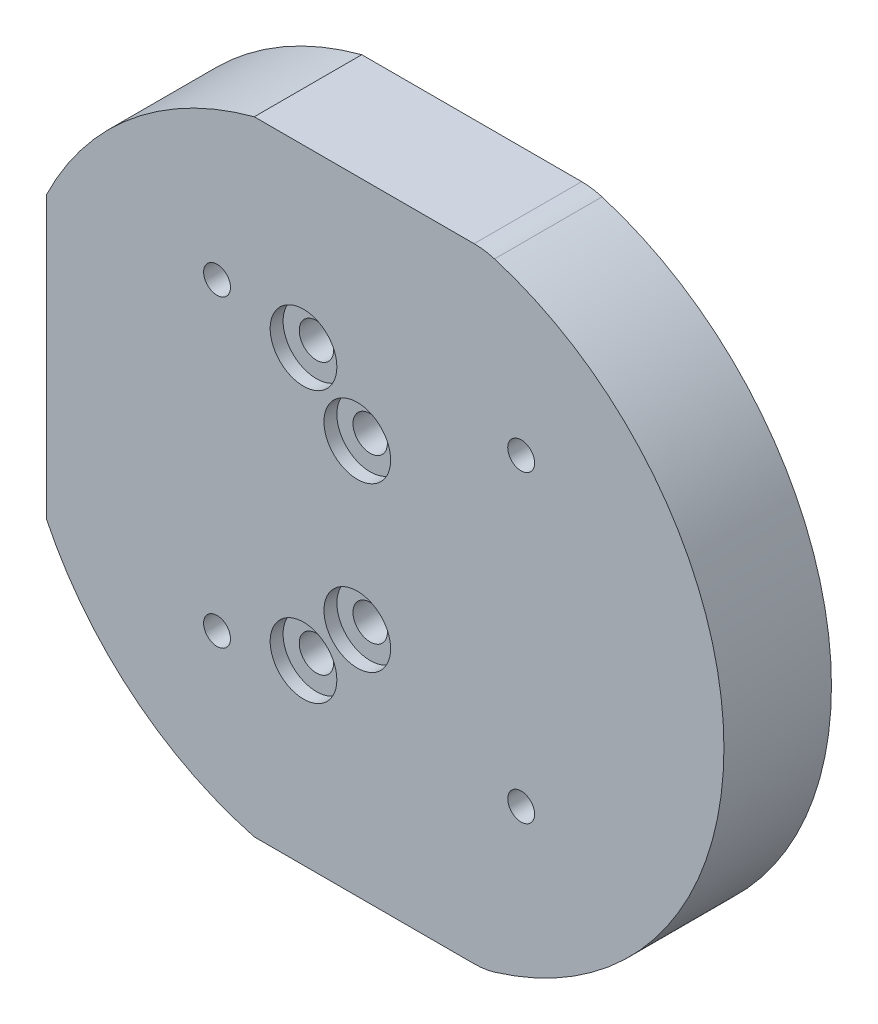
ISO-10303-21;
HEADER;
FILE_DESCRIPTION(('STEP AP214'),'2;1');
FILE_NAME('part.step','',(''),(''),'','','');
FILE_SCHEMA(('AUTOMOTIVE_DESIGN { 1 0 10303 214 1 1 1 1 }'));
ENDSEC;
DATA;
#1=APPLICATION_CONTEXT('core data for automotive mechanical design processes');
#2=APPLICATION_PROTOCOL_DEFINITION('international standard','automotive_design',2000,#1);
#3=PRODUCT_CONTEXT('',#1,'mechanical');
#4=PRODUCT('Part','Part','',(#3));
#5=PRODUCT_RELATED_PRODUCT_CATEGORY('part','',(#4));
#6=PRODUCT_DEFINITION_FORMATION('','',#4);
#7=PRODUCT_DEFINITION_CONTEXT('part definition',#1,'design');
#8=PRODUCT_DEFINITION('design','',#6,#7);
#9=PRODUCT_DEFINITION_SHAPE('','',#8);
#10=(LENGTH_UNIT() NAMED_UNIT(*) SI_UNIT(.MILLI.,.METRE.));
#11=(NAMED_UNIT(*) PLANE_ANGLE_UNIT() SI_UNIT($,.RADIAN.));
#12=(NAMED_UNIT(*) SI_UNIT($,.STERADIAN.) SOLID_ANGLE_UNIT());
#13=UNCERTAINTY_MEASURE_WITH_UNIT(LENGTH_MEASURE(1.E-05),#10,'distance_accuracy_value','');
#14=(GEOMETRIC_REPRESENTATION_CONTEXT(3) GLOBAL_UNCERTAINTY_ASSIGNED_CONTEXT((#13)) GLOBAL_UNIT_ASSIGNED_CONTEXT((#10,
#11,#12)) REPRESENTATION_CONTEXT('',''));
#15=CARTESIAN_POINT('',(0.,0.,0.));
#16=DIRECTION('',(0.,0.,1.));
#17=DIRECTION('',(1.,0.,0.));
#18=AXIS2_PLACEMENT_3D('',#15,#16,#17);
#19=CARTESIAN_POINT('',(-4.1,-21.3115488460901,8.8));
#20=DIRECTION('',(0.,0.,1.));
#21=DIRECTION('',(1.,0.,0.));
#22=AXIS2_PLACEMENT_3D('',#19,#20,#21);
#23=CYLINDRICAL_SURFACE('',#22,3.1);
#24=CARTESIAN_POINT('',(-4.1,-21.3115488460901,8.8));
#25=DIRECTION('',(0.,0.,1.));
#26=DIRECTION('',(1.,0.,0.));
#27=AXIS2_PLACEMENT_3D('',#24,#25,#26);
#28=CIRCLE('',#27,3.1);
#29=CARTESIAN_POINT('',(-1.,-21.3115488460901,8.8));
#30=VERTEX_POINT('',#29);
#31=EDGE_CURVE('E10',#30,#30,#28,.T.);
#32=ORIENTED_EDGE('',*,*,#31,.F.);
#33=EDGE_LOOP('',(#32));
#34=FACE_BOUND('',#33,.T.);
#35=CARTESIAN_POINT('',(-4.1,-21.3115488460901,10.));
#36=DIRECTION('',(0.,0.,1.));
#37=DIRECTION('',(1.,0.,0.));
#38=AXIS2_PLACEMENT_3D('',#35,#36,#37);
#39=CIRCLE('',#38,3.1);
#40=CARTESIAN_POINT('',(-1.,-21.3115488460901,10.));
#41=VERTEX_POINT('',#40);
#42=EDGE_CURVE('E243',#41,#41,#39,.T.);
#43=ORIENTED_EDGE('',*,*,#42,.T.);
#44=EDGE_LOOP('',(#43));
#45=FACE_BOUND('',#44,.T.);
#46=ADVANCED_FACE('F16',(#34,#45),#23,.F.);
#47=CARTESIAN_POINT('',(-4.1,-21.3115488460901,8.8));
#48=DIRECTION('',(0.,0.,1.));
#49=DIRECTION('',(1.,0.,0.));
#50=AXIS2_PLACEMENT_3D('',#47,#48,#49);
#51=PLANE('',#50);
#52=CARTESIAN_POINT('',(-4.1,-21.3115488460901,8.8));
#53=DIRECTION('',(0.,0.,-1.));
#54=DIRECTION('',(1.,0.,0.));
#55=AXIS2_PLACEMENT_3D('',#52,#53,#54);
#56=CIRCLE('',#55,1.6);
#57=CARTESIAN_POINT('',(-2.5,-21.3115488460901,8.8));
#58=VERTEX_POINT('',#57);
#59=EDGE_CURVE('E794',#58,#58,#56,.T.);
#60=ORIENTED_EDGE('',*,*,#59,.T.);
#61=EDGE_LOOP('',(#60));
#62=FACE_BOUND('',#61,.T.);
#63=ORIENTED_EDGE('',*,*,#31,.T.);
#64=EDGE_LOOP('',(#63));
#65=FACE_BOUND('',#64,.T.);
#66=ADVANCED_FACE('F480',(#62,#65),#51,.T.);
#67=CARTESIAN_POINT('',(-9.1,-16.3115488460901,8.8));
#68=DIRECTION('',(0.,0.,1.));
#69=DIRECTION('',(1.,0.,0.));
#70=AXIS2_PLACEMENT_3D('',#67,#68,#69);
#71=CYLINDRICAL_SURFACE('',#70,3.1);
#72=CARTESIAN_POINT('',(-9.1,-16.3115488460901,8.8));
#73=DIRECTION('',(0.,0.,1.));
#74=DIRECTION('',(1.,0.,0.));
#75=AXIS2_PLACEMENT_3D('',#72,#73,#74);
#76=CIRCLE('',#75,3.1);
#77=CARTESIAN_POINT('',(-6.,-16.3115488460901,8.8));
#78=VERTEX_POINT('',#77);
#79=EDGE_CURVE('E30',#78,#78,#76,.T.);
#80=ORIENTED_EDGE('',*,*,#79,.F.);
#81=EDGE_LOOP('',(#80));
#82=FACE_BOUND('',#81,.T.);
#83=CARTESIAN_POINT('',(-9.1,-16.3115488460901,10.));
#84=DIRECTION('',(0.,0.,1.));
#85=DIRECTION('',(1.,0.,0.));
#86=AXIS2_PLACEMENT_3D('',#83,#84,#85);
#87=CIRCLE('',#86,3.1);
#88=CARTESIAN_POINT('',(-6.,-16.3115488460901,10.));
#89=VERTEX_POINT('',#88);
#90=EDGE_CURVE('E199',#89,#89,#87,.T.);
#91=ORIENTED_EDGE('',*,*,#90,.T.);
#92=EDGE_LOOP('',(#91));
#93=FACE_BOUND('',#92,.T.);
#94=ADVANCED_FACE('F477',(#82,#93),#71,.F.);
#95=CARTESIAN_POINT('',(-9.1,-16.3115488460901,8.8));
#96=DIRECTION('',(0.,0.,1.));
#97=DIRECTION('',(1.,0.,0.));
#98=AXIS2_PLACEMENT_3D('',#95,#96,#97);
#99=PLANE('',#98);
#100=CARTESIAN_POINT('',(-9.1,-16.3115488460901,8.8));
#101=DIRECTION('',(0.,0.,-1.));
#102=DIRECTION('',(1.,0.,0.));
#103=AXIS2_PLACEMENT_3D('',#100,#101,#102);
#104=CIRCLE('',#103,1.6);
#105=CARTESIAN_POINT('',(-7.5,-16.3115488460901,8.8));
#106=VERTEX_POINT('',#105);
#107=EDGE_CURVE('E774',#106,#106,#104,.T.);
#108=ORIENTED_EDGE('',*,*,#107,.T.);
#109=EDGE_LOOP('',(#108));
#110=FACE_BOUND('',#109,.T.);
#111=ORIENTED_EDGE('',*,*,#79,.T.);
#112=EDGE_LOOP('',(#111));
#113=FACE_BOUND('',#112,.T.);
#114=ADVANCED_FACE('F479',(#110,#113),#99,.T.);
#115=CARTESIAN_POINT('',(-4.1,-36.5115488460901,8.8));
#116=DIRECTION('',(0.,0.,1.));
#117=DIRECTION('',(1.,0.,0.));
#118=AXIS2_PLACEMENT_3D('',#115,#116,#117);
#119=CYLINDRICAL_SURFACE('',#118,3.1);
#120=CARTESIAN_POINT('',(-4.1,-36.5115488460901,8.8));
#121=DIRECTION('',(0.,0.,1.));
#122=DIRECTION('',(1.,0.,0.));
#123=AXIS2_PLACEMENT_3D('',#120,#121,#122);
#124=CIRCLE('',#123,3.1);
#125=CARTESIAN_POINT('',(-1.,-36.5115488460901,8.8));
#126=VERTEX_POINT('',#125);
#127=EDGE_CURVE('E225',#126,#126,#124,.T.);
#128=ORIENTED_EDGE('',*,*,#127,.F.);
#129=EDGE_LOOP('',(#128));
#130=FACE_BOUND('',#129,.T.);
#131=CARTESIAN_POINT('',(-4.1,-36.5115488460901,10.));
#132=DIRECTION('',(0.,0.,1.));
#133=DIRECTION('',(1.,0.,0.));
#134=AXIS2_PLACEMENT_3D('',#131,#132,#133);
#135=CIRCLE('',#134,3.1);
#136=CARTESIAN_POINT('',(-1.,-36.5115488460901,10.));
#137=VERTEX_POINT('',#136);
#138=EDGE_CURVE('E229',#137,#137,#135,.T.);
#139=ORIENTED_EDGE('',*,*,#138,.T.);
#140=EDGE_LOOP('',(#139));
#141=FACE_BOUND('',#140,.T.);
#142=ADVANCED_FACE('F488',(#130,#141),#119,.F.);
#143=CARTESIAN_POINT('',(-4.1,-36.5115488460901,8.8));
#144=DIRECTION('',(0.,0.,1.));
#145=DIRECTION('',(1.,0.,0.));
#146=AXIS2_PLACEMENT_3D('',#143,#144,#145);
#147=PLANE('',#146);
#148=CARTESIAN_POINT('',(-4.1,-36.5115488460901,8.8));
#149=DIRECTION('',(0.,0.,-1.));
#150=DIRECTION('',(1.,0.,0.));
#151=AXIS2_PLACEMENT_3D('',#148,#149,#150);
#152=CIRCLE('',#151,1.6);
#153=CARTESIAN_POINT('',(-2.5,-36.5115488460901,8.8));
#154=VERTEX_POINT('',#153);
#155=EDGE_CURVE('E427',#154,#154,#152,.T.);
#156=ORIENTED_EDGE('',*,*,#155,.T.);
#157=EDGE_LOOP('',(#156));
#158=FACE_BOUND('',#157,.T.);
#159=ORIENTED_EDGE('',*,*,#127,.T.);
#160=EDGE_LOOP('',(#159));
#161=FACE_BOUND('',#160,.T.);
#162=ADVANCED_FACE('F896',(#158,#161),#147,.T.);
#163=CARTESIAN_POINT('',(-9.1,-41.5115488460901,8.8));
#164=DIRECTION('',(0.,0.,1.));
#165=DIRECTION('',(1.,0.,0.));
#166=AXIS2_PLACEMENT_3D('',#163,#164,#165);
#167=CYLINDRICAL_SURFACE('',#166,3.1);
#168=CARTESIAN_POINT('',(-9.1,-41.5115488460901,8.8));
#169=DIRECTION('',(0.,0.,1.));
#170=DIRECTION('',(1.,0.,0.));
#171=AXIS2_PLACEMENT_3D('',#168,#169,#170);
#172=CIRCLE('',#171,3.1);
#173=CARTESIAN_POINT('',(-6.,-41.5115488460901,8.8));
#174=VERTEX_POINT('',#173);
#175=EDGE_CURVE('E306',#174,#174,#172,.T.);
#176=ORIENTED_EDGE('',*,*,#175,.F.);
#177=EDGE_LOOP('',(#176));
#178=FACE_BOUND('',#177,.T.);
#179=CARTESIAN_POINT('',(-9.1,-41.5115488460901,10.));
#180=DIRECTION('',(0.,0.,1.));
#181=DIRECTION('',(1.,0.,0.));
#182=AXIS2_PLACEMENT_3D('',#179,#180,#181);
#183=CIRCLE('',#182,3.1);
#184=CARTESIAN_POINT('',(-6.,-41.5115488460901,10.));
#185=VERTEX_POINT('',#184);
#186=EDGE_CURVE('E239',#185,#185,#183,.T.);
#187=ORIENTED_EDGE('',*,*,#186,.T.);
#188=EDGE_LOOP('',(#187));
#189=FACE_BOUND('',#188,.T.);
#190=ADVANCED_FACE('F905',(#178,#189),#167,.F.);
#191=CARTESIAN_POINT('',(-9.1,-41.5115488460901,8.8));
#192=DIRECTION('',(0.,0.,1.));
#193=DIRECTION('',(1.,0.,0.));
#194=AXIS2_PLACEMENT_3D('',#191,#192,#193);
#195=PLANE('',#194);
#196=CARTESIAN_POINT('',(-9.1,-41.5115488460901,8.8));
#197=DIRECTION('',(0.,0.,-1.));
#198=DIRECTION('',(1.,0.,0.));
#199=AXIS2_PLACEMENT_3D('',#196,#197,#198);
#200=CIRCLE('',#199,1.6);
#201=CARTESIAN_POINT('',(-7.5,-41.5115488460901,8.8));
#202=VERTEX_POINT('',#201);
#203=EDGE_CURVE('E436',#202,#202,#200,.T.);
#204=ORIENTED_EDGE('',*,*,#203,.T.);
#205=EDGE_LOOP('',(#204));
#206=FACE_BOUND('',#205,.T.);
#207=ORIENTED_EDGE('',*,*,#175,.T.);
#208=EDGE_LOOP('',(#207));
#209=FACE_BOUND('',#208,.T.);
#210=ADVANCED_FACE('F914',(#206,#209),#195,.T.);
#211=CARTESIAN_POINT('',(4.1,-12.5615488460901,6.63553390593274));
#212=DIRECTION('',(0.,0.,-1.));
#213=DIRECTION('',(-1.,0.,0.));
#214=AXIS2_PLACEMENT_3D('',#211,#212,#213);
#215=CYLINDRICAL_SURFACE('',#214,1.25);
#216=CARTESIAN_POINT('',(4.1,-12.5615488460901,3.1));
#217=DIRECTION('',(0.,0.,-1.));
#218=DIRECTION('',(1.,0.,0.));
#219=AXIS2_PLACEMENT_3D('',#216,#217,#218);
#220=CIRCLE('',#219,1.25);
#221=CARTESIAN_POINT('',(4.1,-11.3115488460901,3.1));
#222=VERTEX_POINT('',#221);
#223=CARTESIAN_POINT('',(4.1,-13.8115488460901,3.1));
#224=VERTEX_POINT('',#223);
#225=EDGE_CURVE('E289',#222,#224,#220,.T.);
#226=ORIENTED_EDGE('',*,*,#225,.F.);
#227=DIRECTION('',(0.,0.,-1.));
#228=VECTOR('',#227,1.);
#229=CARTESIAN_POINT('',(4.1,-11.3115488460901,45.826758636053));
#230=LINE('',#229,#228);
#231=CARTESIAN_POINT('',(4.1,-11.3115488460901,0.));
#232=VERTEX_POINT('',#231);
#233=EDGE_CURVE('E293',#222,#232,#230,.T.);
#234=ORIENTED_EDGE('',*,*,#233,.T.);
#235=CARTESIAN_POINT('',(4.1,-12.5615488460901,0.));
#236=DIRECTION('',(0.,0.,-1.));
#237=DIRECTION('',(-1.,0.,0.));
#238=AXIS2_PLACEMENT_3D('',#235,#236,#237);
#239=CIRCLE('',#238,1.25);
#240=CARTESIAN_POINT('',(4.1,-13.8115488460901,0.));
#241=VERTEX_POINT('',#240);
#242=EDGE_CURVE('E219',#232,#241,#239,.T.);
#243=ORIENTED_EDGE('',*,*,#242,.T.);
#244=DIRECTION('',(0.,0.,-1.));
#245=VECTOR('',#244,1.);
#246=CARTESIAN_POINT('',(4.1,-13.8115488460901,6.63553390593274));
#247=LINE('',#246,#245);
#248=EDGE_CURVE('E359',#224,#241,#247,.T.);
#249=ORIENTED_EDGE('',*,*,#248,.F.);
#250=EDGE_LOOP('',(#226,#234,#243,#249));
#251=FACE_BOUND('',#250,.T.);
#252=ADVANCED_FACE('F529',(#251),#215,.F.);
#253=CARTESIAN_POINT('',(4.1,-45.2615488460901,6.63553390593274));
#254=DIRECTION('',(0.,0.,-1.));
#255=DIRECTION('',(-1.,0.,0.));
#256=AXIS2_PLACEMENT_3D('',#253,#254,#255);
#257=CYLINDRICAL_SURFACE('',#256,1.25);
#258=CARTESIAN_POINT('',(4.1,-45.2615488460901,0.));
#259=DIRECTION('',(0.,0.,-1.));
#260=DIRECTION('',(-1.,0.,0.));
#261=AXIS2_PLACEMENT_3D('',#258,#259,#260);
#262=CIRCLE('',#261,1.25);
#263=CARTESIAN_POINT('',(4.1,-44.0115488460901,0.));
#264=VERTEX_POINT('',#263);
#265=CARTESIAN_POINT('',(4.1,-46.5115488460901,0.));
#266=VERTEX_POINT('',#265);
#267=EDGE_CURVE('E352',#264,#266,#262,.T.);
#268=ORIENTED_EDGE('',*,*,#267,.T.);
#269=DIRECTION('',(0.,0.,-1.));
#270=VECTOR('',#269,1.);
#271=CARTESIAN_POINT('',(4.1,-46.5115488460901,45.826758636053));
#272=LINE('',#271,#270);
#273=CARTESIAN_POINT('',(4.1,-46.5115488460901,3.1));
#274=VERTEX_POINT('',#273);
#275=EDGE_CURVE('E279',#274,#266,#272,.T.);
#276=ORIENTED_EDGE('',*,*,#275,.F.);
#277=CARTESIAN_POINT('',(4.1,-45.2615488460901,3.1));
#278=DIRECTION('',(0.,0.,-1.));
#279=DIRECTION('',(1.,0.,0.));
#280=AXIS2_PLACEMENT_3D('',#277,#278,#279);
#281=CIRCLE('',#280,1.25);
#282=CARTESIAN_POINT('',(4.1,-44.0115488460901,3.1));
#283=VERTEX_POINT('',#282);
#284=EDGE_CURVE('E44',#283,#274,#281,.T.);
#285=ORIENTED_EDGE('',*,*,#284,.F.);
#286=DIRECTION('',(0.,0.,1.));
#287=VECTOR('',#286,1.);
#288=CARTESIAN_POINT('',(4.1,-44.0115488460901,6.63553390593274));
#289=LINE('',#288,#287);
#290=EDGE_CURVE('E297',#264,#283,#289,.T.);
#291=ORIENTED_EDGE('',*,*,#290,.F.);
#292=EDGE_LOOP('',(#268,#276,#285,#291));
#293=FACE_BOUND('',#292,.T.);
#294=ADVANCED_FACE('F524',(#293),#257,.F.);
#295=CARTESIAN_POINT('',(0.,0.,3.1));
#296=DIRECTION('',(0.,0.,1.));
#297=DIRECTION('',(1.,0.,0.));
#298=AXIS2_PLACEMENT_3D('',#295,#296,#297);
#299=PLANE('',#298);
#300=CARTESIAN_POINT('',(-9.1,-41.5115488460901,3.1));
#301=DIRECTION('',(0.,0.,1.));
#302=DIRECTION('',(1.,0.,0.));
#303=AXIS2_PLACEMENT_3D('',#300,#301,#302);
#304=CIRCLE('',#303,1.6);
#305=CARTESIAN_POINT('',(-7.5,-41.5115488460901,3.1));
#306=VERTEX_POINT('',#305);
#307=EDGE_CURVE('E423',#306,#306,#304,.T.);
#308=ORIENTED_EDGE('',*,*,#307,.T.);
#309=EDGE_LOOP('',(#308));
#310=FACE_BOUND('',#309,.T.);
#311=CARTESIAN_POINT('',(-4.1,-21.3115488460901,3.1));
#312=DIRECTION('',(0.,0.,1.));
#313=DIRECTION('',(1.,0.,0.));
#314=AXIS2_PLACEMENT_3D('',#311,#312,#313);
#315=CIRCLE('',#314,1.6);
#316=CARTESIAN_POINT('',(-2.5,-21.3115488460901,3.1));
#317=VERTEX_POINT('',#316);
#318=EDGE_CURVE('E536',#317,#317,#315,.T.);
#319=ORIENTED_EDGE('',*,*,#318,.T.);
#320=EDGE_LOOP('',(#319));
#321=FACE_BOUND('',#320,.T.);
#322=CARTESIAN_POINT('',(-4.1,-36.5115488460901,3.1));
#323=DIRECTION('',(0.,0.,1.));
#324=DIRECTION('',(1.,0.,0.));
#325=AXIS2_PLACEMENT_3D('',#322,#323,#324);
#326=CIRCLE('',#325,1.6);
#327=CARTESIAN_POINT('',(-2.5,-36.5115488460901,3.1));
#328=VERTEX_POINT('',#327);
#329=EDGE_CURVE('E431',#328,#328,#326,.T.);
#330=ORIENTED_EDGE('',*,*,#329,.T.);
#331=EDGE_LOOP('',(#330));
#332=FACE_BOUND('',#331,.T.);
#333=CARTESIAN_POINT('',(-9.1,-16.3115488460901,3.1));
#334=DIRECTION('',(0.,0.,1.));
#335=DIRECTION('',(1.,0.,0.));
#336=AXIS2_PLACEMENT_3D('',#333,#334,#335);
#337=CIRCLE('',#336,1.6);
#338=CARTESIAN_POINT('',(-7.5,-16.3115488460901,3.1));
#339=VERTEX_POINT('',#338);
#340=EDGE_CURVE('E432',#339,#339,#337,.T.);
#341=ORIENTED_EDGE('',*,*,#340,.T.);
#342=EDGE_LOOP('',(#341));
#343=FACE_BOUND('',#342,.T.);
#344=DIRECTION('',(1.,0.,0.));
#345=VECTOR('',#344,1.);
#346=CARTESIAN_POINT('',(4.1,-11.3115488460901,3.1));
#347=LINE('',#346,#345);
#348=CARTESIAN_POINT('',(-9.1,-11.3115488460901,3.1));
#349=VERTEX_POINT('',#348);
#350=EDGE_CURVE('E296',#349,#222,#347,.T.);
#351=ORIENTED_EDGE('',*,*,#350,.T.);
#352=ORIENTED_EDGE('',*,*,#225,.T.);
#353=DIRECTION('',(0.,-1.,0.));
#354=VECTOR('',#353,1.);
#355=CARTESIAN_POINT('',(4.1,-46.5115488460901,3.1));
#356=LINE('',#355,#354);
#357=EDGE_CURVE('E356',#224,#283,#356,.T.);
#358=ORIENTED_EDGE('',*,*,#357,.T.);
#359=ORIENTED_EDGE('',*,*,#284,.T.);
#360=DIRECTION('',(-1.,0.,0.));
#361=VECTOR('',#360,1.);
#362=CARTESIAN_POINT('',(4.1,-46.5115488460901,3.1));
#363=LINE('',#362,#361);
#364=CARTESIAN_POINT('',(-9.1,-46.5115488460901,3.1));
#365=VERTEX_POINT('',#364);
#366=EDGE_CURVE('E52',#274,#365,#363,.T.);
#367=ORIENTED_EDGE('',*,*,#366,.T.);
#368=CARTESIAN_POINT('',(-9.1,-41.5115488460901,3.1));
#369=DIRECTION('',(0.,0.,-1.));
#370=DIRECTION('',(1.,0.,0.));
#371=AXIS2_PLACEMENT_3D('',#368,#369,#370);
#372=CIRCLE('',#371,5.);
#373=CARTESIAN_POINT('',(-14.1,-41.5115488460901,3.1));
#374=VERTEX_POINT('',#373);
#375=EDGE_CURVE('E373',#365,#374,#372,.T.);
#376=ORIENTED_EDGE('',*,*,#375,.T.);
#377=DIRECTION('',(0.,1.,0.));
#378=VECTOR('',#377,1.);
#379=CARTESIAN_POINT('',(-14.1,-41.5115488460901,3.1));
#380=LINE('',#379,#378);
#381=CARTESIAN_POINT('',(-14.1,-16.3115488460901,3.1));
#382=VERTEX_POINT('',#381);
#383=EDGE_CURVE('E346',#374,#382,#380,.T.);
#384=ORIENTED_EDGE('',*,*,#383,.T.);
#385=CARTESIAN_POINT('',(-9.1,-16.3115488460901,3.1));
#386=DIRECTION('',(0.,0.,-1.));
#387=DIRECTION('',(1.,0.,0.));
#388=AXIS2_PLACEMENT_3D('',#385,#386,#387);
#389=CIRCLE('',#388,5.);
#390=EDGE_CURVE('E347',#382,#349,#389,.T.);
#391=ORIENTED_EDGE('',*,*,#390,.T.);
#392=EDGE_LOOP('',(#351,#352,#358,#359,#367,#376,#384,#391));
#393=FACE_BOUND('',#392,.T.);
#394=ADVANCED_FACE('F521',(#310,#321,#332,#343,#393),#299,.F.);
#395=CARTESIAN_POINT('',(4.1,-46.5115488460901,45.826758636053));
#396=DIRECTION('',(0.,-1.,0.));
#397=DIRECTION('',(0.,0.,-1.));
#398=AXIS2_PLACEMENT_3D('',#395,#396,#397);
#399=PLANE('',#398);
#400=DIRECTION('',(0.,0.,-1.));
#401=VECTOR('',#400,1.);
#402=CARTESIAN_POINT('',(-9.1,-46.5115488460901,45.826758636053));
#403=LINE('',#402,#401);
#404=CARTESIAN_POINT('',(-9.1,-46.5115488460901,0.));
#405=VERTEX_POINT('',#404);
#406=EDGE_CURVE('E215',#365,#405,#403,.T.);
#407=ORIENTED_EDGE('',*,*,#406,.F.);
#408=ORIENTED_EDGE('',*,*,#366,.F.);
#409=ORIENTED_EDGE('',*,*,#275,.T.);
#410=DIRECTION('',(1.,0.,0.));
#411=VECTOR('',#410,1.);
#412=CARTESIAN_POINT('',(0.,-46.5115488460901,0.));
#413=LINE('',#412,#411);
#414=EDGE_CURVE('E350',#405,#266,#413,.T.);
#415=ORIENTED_EDGE('',*,*,#414,.F.);
#416=EDGE_LOOP('',(#407,#408,#409,#415));
#417=FACE_BOUND('',#416,.T.);
#418=ADVANCED_FACE('F518',(#417),#399,.F.);
#419=CARTESIAN_POINT('',(-9.1,-41.5115488460901,45.826758636053));
#420=DIRECTION('',(0.,0.,-1.));
#421=DIRECTION('',(-1.,0.,0.));
#422=AXIS2_PLACEMENT_3D('',#419,#420,#421);
#423=CYLINDRICAL_SURFACE('',#422,5.);
#424=DIRECTION('',(0.,0.,-1.));
#425=VECTOR('',#424,1.);
#426=CARTESIAN_POINT('',(-14.1,-41.5115488460901,45.826758636053));
#427=LINE('',#426,#425);
#428=CARTESIAN_POINT('',(-14.1,-41.5115488460901,0.));
#429=VERTEX_POINT('',#428);
#430=EDGE_CURVE('E376',#374,#429,#427,.T.);
#431=ORIENTED_EDGE('',*,*,#430,.F.);
#432=ORIENTED_EDGE('',*,*,#375,.F.);
#433=ORIENTED_EDGE('',*,*,#406,.T.);
#434=CARTESIAN_POINT('',(-9.1,-41.5115488460901,0.));
#435=DIRECTION('',(0.,0.,1.));
#436=DIRECTION('',(1.,0.,0.));
#437=AXIS2_PLACEMENT_3D('',#434,#435,#436);
#438=CIRCLE('',#437,5.);
#439=EDGE_CURVE('E342',#429,#405,#438,.T.);
#440=ORIENTED_EDGE('',*,*,#439,.F.);
#441=EDGE_LOOP('',(#431,#432,#433,#440));
#442=FACE_BOUND('',#441,.T.);
#443=ADVANCED_FACE('F514',(#442),#423,.F.);
#444=CARTESIAN_POINT('',(-14.1,-41.5115488460901,45.826758636053));
#445=DIRECTION('',(-1.,0.,0.));
#446=DIRECTION('',(0.,0.,1.));
#447=AXIS2_PLACEMENT_3D('',#444,#445,#446);
#448=PLANE('',#447);
#449=DIRECTION('',(0.,0.,-1.));
#450=VECTOR('',#449,1.);
#451=CARTESIAN_POINT('',(-14.1,-16.3115488460901,45.826758636053));
#452=LINE('',#451,#450);
#453=CARTESIAN_POINT('',(-14.1,-16.3115488460901,0.));
#454=VERTEX_POINT('',#453);
#455=EDGE_CURVE('E343',#382,#454,#452,.T.);
#456=ORIENTED_EDGE('',*,*,#455,.F.);
#457=ORIENTED_EDGE('',*,*,#383,.F.);
#458=ORIENTED_EDGE('',*,*,#430,.T.);
#459=DIRECTION('',(0.,-1.,0.));
#460=VECTOR('',#459,1.);
#461=CARTESIAN_POINT('',(-14.1,0.,0.));
#462=LINE('',#461,#460);
#463=EDGE_CURVE('E338',#454,#429,#462,.T.);
#464=ORIENTED_EDGE('',*,*,#463,.F.);
#465=EDGE_LOOP('',(#456,#457,#458,#464));
#466=FACE_BOUND('',#465,.T.);
#467=ADVANCED_FACE('F510',(#466),#448,.F.);
#468=CARTESIAN_POINT('',(-9.1,-16.3115488460901,45.826758636053));
#469=DIRECTION('',(0.,0.,-1.));
#470=DIRECTION('',(-1.,0.,0.));
#471=AXIS2_PLACEMENT_3D('',#468,#469,#470);
#472=CYLINDRICAL_SURFACE('',#471,5.);
#473=DIRECTION('',(0.,0.,-1.));
#474=VECTOR('',#473,1.);
#475=CARTESIAN_POINT('',(-9.1,-11.3115488460901,45.826758636053));
#476=LINE('',#475,#474);
#477=CARTESIAN_POINT('',(-9.1,-11.3115488460901,0.));
#478=VERTEX_POINT('',#477);
#479=EDGE_CURVE('E368',#349,#478,#476,.T.);
#480=ORIENTED_EDGE('',*,*,#479,.F.);
#481=ORIENTED_EDGE('',*,*,#390,.F.);
#482=ORIENTED_EDGE('',*,*,#455,.T.);
#483=CARTESIAN_POINT('',(-9.1,-16.3115488460901,0.));
#484=DIRECTION('',(0.,0.,1.));
#485=DIRECTION('',(1.,0.,0.));
#486=AXIS2_PLACEMENT_3D('',#483,#484,#485);
#487=CIRCLE('',#486,5.);
#488=EDGE_CURVE('E334',#478,#454,#487,.T.);
#489=ORIENTED_EDGE('',*,*,#488,.F.);
#490=EDGE_LOOP('',(#480,#481,#482,#489));
#491=FACE_BOUND('',#490,.T.);
#492=ADVANCED_FACE('F507',(#491),#472,.F.);
#493=CARTESIAN_POINT('',(4.1,-11.3115488460901,45.826758636053));
#494=DIRECTION('',(0.,1.,0.));
#495=DIRECTION('',(1.,0.,0.));
#496=AXIS2_PLACEMENT_3D('',#493,#494,#495);
#497=PLANE('',#496);
#498=ORIENTED_EDGE('',*,*,#233,.F.);
#499=ORIENTED_EDGE('',*,*,#350,.F.);
#500=ORIENTED_EDGE('',*,*,#479,.T.);
#501=DIRECTION('',(-1.,0.,0.));
#502=VECTOR('',#501,1.);
#503=CARTESIAN_POINT('',(0.,-11.3115488460901,0.));
#504=LINE('',#503,#502);
#505=EDGE_CURVE('E330',#232,#478,#504,.T.);
#506=ORIENTED_EDGE('',*,*,#505,.F.);
#507=EDGE_LOOP('',(#498,#499,#500,#506));
#508=FACE_BOUND('',#507,.T.);
#509=ADVANCED_FACE('F505',(#508),#497,.F.);
#510=CARTESIAN_POINT('',(4.1,-46.5115488460901,45.826758636053));
#511=DIRECTION('',(1.,0.,0.));
#512=DIRECTION('',(0.,1.,0.));
#513=AXIS2_PLACEMENT_3D('',#510,#511,#512);
#514=PLANE('',#513);
#515=ORIENTED_EDGE('',*,*,#357,.F.);
#516=ORIENTED_EDGE('',*,*,#248,.T.);
#517=DIRECTION('',(0.,1.,0.));
#518=VECTOR('',#517,1.);
#519=CARTESIAN_POINT('',(4.1,0.,0.));
#520=LINE('',#519,#518);
#521=EDGE_CURVE('E216',#264,#241,#520,.T.);
#522=ORIENTED_EDGE('',*,*,#521,.F.);
#523=ORIENTED_EDGE('',*,*,#290,.T.);
#524=EDGE_LOOP('',(#515,#516,#522,#523));
#525=FACE_BOUND('',#524,.T.);
#526=ADVANCED_FACE('F554',(#525),#514,.F.);
#527=CARTESIAN_POINT('',(0.,0.,0.));
#528=DIRECTION('',(0.,0.,1.));
#529=DIRECTION('',(1.,0.,0.));
#530=AXIS2_PLACEMENT_3D('',#527,#528,#529);
#531=PLANE('',#530);
#532=CARTESIAN_POINT('',(-17.1421356237307,-43.1421356237324,0.));
#533=DIRECTION('',(0.,0.,1.));
#534=DIRECTION('',(1.,0.,0.));
#535=AXIS2_PLACEMENT_3D('',#532,#533,#534);
#536=CIRCLE('',#535,1.25);
#537=CARTESIAN_POINT('',(-15.8921356237307,-43.1421356237324,0.));
#538=VERTEX_POINT('',#537);
#539=EDGE_CURVE('E257',#538,#538,#536,.T.);
#540=ORIENTED_EDGE('',*,*,#539,.T.);
#541=EDGE_LOOP('',(#540));
#542=FACE_BOUND('',#541,.T.);
#543=CARTESIAN_POINT('',(-17.1421356237305,-14.8578643762705,0.));
#544=DIRECTION('',(0.,0.,1.));
#545=DIRECTION('',(1.,0.,0.));
#546=AXIS2_PLACEMENT_3D('',#543,#544,#545);
#547=CIRCLE('',#546,1.25);
#548=CARTESIAN_POINT('',(-15.8921356237305,-14.8578643762705,0.));
#549=VERTEX_POINT('',#548);
#550=EDGE_CURVE('E261',#549,#549,#547,.T.);
#551=ORIENTED_EDGE('',*,*,#550,.T.);
#552=EDGE_LOOP('',(#551));
#553=FACE_BOUND('',#552,.T.);
#554=CARTESIAN_POINT('',(11.1421356237315,-14.8578643762708,0.));
#555=DIRECTION('',(0.,0.,1.));
#556=DIRECTION('',(1.,0.,0.));
#557=AXIS2_PLACEMENT_3D('',#554,#555,#556);
#558=CIRCLE('',#557,1.25);
#559=CARTESIAN_POINT('',(12.3921356237315,-14.8578643762708,0.));
#560=VERTEX_POINT('',#559);
#561=EDGE_CURVE('E262',#560,#560,#558,.T.);
#562=ORIENTED_EDGE('',*,*,#561,.T.);
#563=EDGE_LOOP('',(#562));
#564=FACE_BOUND('',#563,.T.);
#565=CARTESIAN_POINT('',(11.1421356237311,-43.1421356237327,0.));
#566=DIRECTION('',(0.,0.,1.));
#567=DIRECTION('',(1.,0.,0.));
#568=AXIS2_PLACEMENT_3D('',#565,#566,#567);
#569=CIRCLE('',#568,1.25);
#570=CARTESIAN_POINT('',(12.3921356237311,-43.1421356237327,0.));
#571=VERTEX_POINT('',#570);
#572=EDGE_CURVE('E266',#571,#571,#569,.T.);
#573=ORIENTED_EDGE('',*,*,#572,.T.);
#574=EDGE_LOOP('',(#573));
#575=FACE_BOUND('',#574,.T.);
#576=ORIENTED_EDGE('',*,*,#521,.T.);
#577=ORIENTED_EDGE('',*,*,#242,.F.);
#578=ORIENTED_EDGE('',*,*,#505,.T.);
#579=ORIENTED_EDGE('',*,*,#488,.T.);
#580=ORIENTED_EDGE('',*,*,#463,.T.);
#581=ORIENTED_EDGE('',*,*,#439,.T.);
#582=ORIENTED_EDGE('',*,*,#414,.T.);
#583=ORIENTED_EDGE('',*,*,#267,.F.);
#584=EDGE_LOOP('',(#576,#577,#578,#579,#580,#581,#582,#583));
#585=FACE_BOUND('',#584,.T.);
#586=DIRECTION('',(1.,1.6772697155592E-13,0.));
#587=VECTOR('',#586,1.);
#588=CARTESIAN_POINT('',(9.72816435024355E-12,-58.000000000001,0.));
#589=LINE('',#588,#587);
#590=CARTESIAN_POINT('',(-13.6811457478622,-58.0000000000015,0.));
#591=VERTEX_POINT('',#590);
#592=CARTESIAN_POINT('',(6.76336093194263,-58.,0.));
#593=VERTEX_POINT('',#592);
#594=EDGE_CURVE('E220',#591,#593,#589,.T.);
#595=ORIENTED_EDGE('',*,*,#594,.F.);
#596=CARTESIAN_POINT('',(-5.99999999999979,-29.,0.));
#597=DIRECTION('',(0.,0.,1.));
#598=DIRECTION('',(1.,0.,0.));
#599=AXIS2_PLACEMENT_3D('',#596,#597,#598);
#600=CIRCLE('',#599,30.);
#601=CARTESIAN_POINT('',(-33.,-42.0766968306217,0.));
#602=VERTEX_POINT('',#601);
#603=EDGE_CURVE('E185',#602,#591,#600,.T.);
#604=ORIENTED_EDGE('',*,*,#603,.F.);
#605=DIRECTION('',(0.,-1.,0.));
#606=VECTOR('',#605,1.);
#607=CARTESIAN_POINT('',(-33.,0.,0.));
#608=LINE('',#607,#606);
#609=CARTESIAN_POINT('',(-33.,-15.9233031693781,0.));
#610=VERTEX_POINT('',#609);
#611=EDGE_CURVE('E283',#610,#602,#608,.T.);
#612=ORIENTED_EDGE('',*,*,#611,.F.);
#613=CARTESIAN_POINT('',(-5.99999999999979,-29.,0.));
#614=DIRECTION('',(0.,0.,1.));
#615=DIRECTION('',(1.,0.,0.));
#616=AXIS2_PLACEMENT_3D('',#613,#614,#615);
#617=CIRCLE('',#616,30.);
#618=CARTESIAN_POINT('',(-13.6811457478679,2.18575157973078E-13,0.));
#619=VERTEX_POINT('',#618);
#620=EDGE_CURVE('E275',#619,#610,#617,.T.);
#621=ORIENTED_EDGE('',*,*,#620,.F.);
#622=DIRECTION('',(-1.,0.,0.));
#623=VECTOR('',#622,1.);
#624=CARTESIAN_POINT('',(0.,0.,0.));
#625=LINE('',#624,#623);
#626=CARTESIAN_POINT('',(6.76336093194259,0.,0.));
#627=VERTEX_POINT('',#626);
#628=EDGE_CURVE('E274',#627,#619,#625,.T.);
#629=ORIENTED_EDGE('',*,*,#628,.F.);
#630=CARTESIAN_POINT('',(8.66443893251184,-0.278416987145032,0.));
#631=CARTESIAN_POINT('',(8.04453893930656,-0.0914326300073993,0.));
#632=CARTESIAN_POINT('',(7.41064568463274,3.38503075398694E-06,0.));
#633=CARTESIAN_POINT('',(6.76336093194259,0.,0.));
#634=B_SPLINE_CURVE_WITH_KNOTS('',3,(#630,#631,#632,#633),.UNSPECIFIED.,.F.,.F.,(4,4),(0.,1.),.UNSPECIFIED.);
#635=CARTESIAN_POINT('',(8.66443893251184,-0.278416987145032,0.));
#636=VERTEX_POINT('',#635);
#637=EDGE_CURVE('E310',#636,#627,#634,.T.);
#638=ORIENTED_EDGE('',*,*,#637,.F.);
#639=CARTESIAN_POINT('',(0.,-28.999998200825,0.));
#640=DIRECTION('',(0.,0.,1.));
#641=DIRECTION('',(1.,0.,0.));
#642=AXIS2_PLACEMENT_3D('',#639,#640,#641);
#643=CIRCLE('',#642,30.0000288238068);
#644=CARTESIAN_POINT('',(8.66443793809876,-57.7215797144895,0.));
#645=VERTEX_POINT('',#644);
#646=EDGE_CURVE('E315',#645,#636,#643,.T.);
#647=ORIENTED_EDGE('',*,*,#646,.F.);
#648=CARTESIAN_POINT('',(6.76336093194263,-58.,0.));
#649=CARTESIAN_POINT('',(7.41064551418521,-58.0000022370291,0.));
#650=CARTESIAN_POINT('',(8.04453843976434,-57.9085651218194,0.));
#651=CARTESIAN_POINT('',(8.66443793809876,-57.7215797144895,0.));
#652=B_SPLINE_CURVE_WITH_KNOTS('',3,(#648,#649,#650,#651),.UNSPECIFIED.,.F.,.F.,(4,4),(0.,1.),.UNSPECIFIED.);
#653=EDGE_CURVE('E322',#593,#645,#652,.T.);
#654=ORIENTED_EDGE('',*,*,#653,.F.);
#655=EDGE_LOOP('',(#595,#604,#612,#621,#629,#638,#647,#654));
#656=FACE_BOUND('',#655,.T.);
#657=ADVANCED_FACE('F449',(#542,#553,#564,#575,#585,#656),#531,.F.);
#658=CARTESIAN_POINT('',(9.72816435024355E-12,-58.000000000001,3.));
#659=DIRECTION('',(-1.6772697155592E-13,1.,0.));
#660=DIRECTION('',(1.,1.6772697155592E-13,0.));
#661=AXIS2_PLACEMENT_3D('',#658,#659,#660);
#662=PLANE('',#661);
#663=ORIENTED_EDGE('',*,*,#594,.T.);
#664=DIRECTION('',(0.,0.,-1.));
#665=VECTOR('',#664,1.);
#666=CARTESIAN_POINT('',(6.76336093194263,-58.,3.));
#667=LINE('',#666,#665);
#668=CARTESIAN_POINT('',(6.76336093194263,-58.,10.));
#669=VERTEX_POINT('',#668);
#670=EDGE_CURVE('E194',#669,#593,#667,.T.);
#671=ORIENTED_EDGE('',*,*,#670,.F.);
#672=DIRECTION('',(-1.,0.,0.));
#673=VECTOR('',#672,1.);
#674=CARTESIAN_POINT('',(6.76336093194263,-58.,10.));
#675=LINE('',#674,#673);
#676=CARTESIAN_POINT('',(-13.6811457478622,-58.0000000000015,10.));
#677=VERTEX_POINT('',#676);
#678=EDGE_CURVE('E191',#669,#677,#675,.T.);
#679=ORIENTED_EDGE('',*,*,#678,.T.);
#680=DIRECTION('',(0.,0.,-1.));
#681=VECTOR('',#680,1.);
#682=CARTESIAN_POINT('',(-13.6811457478622,-58.0000000000015,3.));
#683=LINE('',#682,#681);
#684=EDGE_CURVE('E177',#677,#591,#683,.T.);
#685=ORIENTED_EDGE('',*,*,#684,.T.);
#686=EDGE_LOOP('',(#663,#671,#679,#685));
#687=FACE_BOUND('',#686,.T.);
#688=ADVANCED_FACE('F192',(#687),#662,.F.);
#689=CARTESIAN_POINT('',(6.76336093194263,-58.,10.));
#690=CARTESIAN_POINT('',(6.76336093194263,-58.,0.));
#691=CARTESIAN_POINT('',(7.41064551418521,-58.0000022370291,10.));
#692=CARTESIAN_POINT('',(7.41064551418521,-58.0000022370291,0.));
#693=CARTESIAN_POINT('',(8.04453843976434,-57.9085651218194,10.));
#694=CARTESIAN_POINT('',(8.04453843976434,-57.9085651218194,0.));
#695=CARTESIAN_POINT('',(8.66443793809881,-57.7215797144895,10.));
#696=CARTESIAN_POINT('',(8.66443793809881,-57.7215797144895,0.));
#697=B_SPLINE_SURFACE_WITH_KNOTS('',3,1,((#689,#690),(#691,#692),(#693,#694),(#695,#696)),
.UNSPECIFIED.,.F.,.F.,.F.,(4,4),(2,2),(0.,1.),(0.,1.),.UNSPECIFIED.);
#698=DIRECTION('',(0.,0.,-1.));
#699=VECTOR('',#698,1.);
#700=CARTESIAN_POINT('',(8.66443793809876,-57.7215797144895,3.));
#701=LINE('',#700,#699);
#702=CARTESIAN_POINT('',(8.66443793677571,-57.7215797148886,10.));
#703=VERTEX_POINT('',#702);
#704=EDGE_CURVE('E318',#703,#645,#701,.T.);
#705=CARTESIAN_POINT('',(8.66443793677571,-57.7215797148886,10.));
#706=CARTESIAN_POINT('',(8.04453843976434,-57.9085651218194,10.));
#707=CARTESIAN_POINT('',(7.41064551418521,-58.0000022370291,10.));
#708=CARTESIAN_POINT('',(6.76336093194263,-58.,10.));
#709=B_SPLINE_CURVE_WITH_KNOTS('',3,(#705,#706,#707,#708),.UNSPECIFIED.,.F.,.F.,(4,4),(0.,1.),.UNSPECIFIED.);
#710=EDGE_CURVE('E22',#703,#669,#709,.T.);
#711=ORIENTED_EDGE('',*,*,#653,.T.);
#712=ORIENTED_EDGE('',*,*,#704,.F.);
#713=ORIENTED_EDGE('',*,*,#710,.T.);
#714=ORIENTED_EDGE('',*,*,#670,.T.);
#715=EDGE_LOOP('',(#711,#712,#713,#714));
#716=FACE_BOUND('',#715,.T.);
#717=ADVANCED_FACE('F999',(#716),#697,.F.);
#718=CARTESIAN_POINT('',(0.,-28.999998200825,3.));
#719=DIRECTION('',(0.,0.,-1.));
#720=DIRECTION('',(-1.,0.,0.));
#721=AXIS2_PLACEMENT_3D('',#718,#719,#720);
#722=CYLINDRICAL_SURFACE('',#721,30.0000288238068);
#723=ORIENTED_EDGE('',*,*,#646,.T.);
#724=DIRECTION('',(0.,0.,-1.));
#725=VECTOR('',#724,1.);
#726=CARTESIAN_POINT('',(8.66443893251184,-0.278416987145032,3.));
#727=LINE('',#726,#725);
#728=CARTESIAN_POINT('',(8.66443893326502,-0.27841698737223,10.));
#729=VERTEX_POINT('',#728);
#730=EDGE_CURVE('E311',#729,#636,#727,.T.);
#731=ORIENTED_EDGE('',*,*,#730,.F.);
#732=CARTESIAN_POINT('',(0.,-28.999998200825,10.));
#733=DIRECTION('',(0.,0.,-1.));
#734=DIRECTION('',(-1.,0.,0.));
#735=AXIS2_PLACEMENT_3D('',#732,#733,#734);
#736=CIRCLE('',#735,30.0000288238068);
#737=EDGE_CURVE('E404',#729,#703,#736,.T.);
#738=ORIENTED_EDGE('',*,*,#737,.T.);
#739=ORIENTED_EDGE('',*,*,#704,.T.);
#740=EDGE_LOOP('',(#723,#731,#738,#739));
#741=FACE_BOUND('',#740,.T.);
#742=ADVANCED_FACE('F995',(#741),#722,.T.);
#743=CARTESIAN_POINT('',(8.66443893251184,-0.278416987145046,10.));
#744=CARTESIAN_POINT('',(8.66443893251184,-0.278416987145046,0.));
#745=CARTESIAN_POINT('',(8.04453893930656,-0.0914326300073993,10.));
#746=CARTESIAN_POINT('',(8.04453893930656,-0.0914326300073993,0.));
#747=CARTESIAN_POINT('',(7.41064568463274,3.38503075398694E-06,10.));
#748=CARTESIAN_POINT('',(7.41064568463274,3.38503075398694E-06,0.));
#749=CARTESIAN_POINT('',(6.76336093194259,0.,10.));
#750=CARTESIAN_POINT('',(6.76336093194259,0.,0.));
#751=B_SPLINE_SURFACE_WITH_KNOTS('',3,1,((#743,#744),(#745,#746),(#747,#748),(#749,#750)),
.UNSPECIFIED.,.F.,.F.,.F.,(4,4),(2,2),(0.,1.),(0.,1.),.UNSPECIFIED.);
#752=DIRECTION('',(0.,0.,-1.));
#753=VECTOR('',#752,1.);
#754=CARTESIAN_POINT('',(6.76336093194259,0.,3.));
#755=LINE('',#754,#753);
#756=CARTESIAN_POINT('',(6.76336093194259,0.,10.));
#757=VERTEX_POINT('',#756);
#758=EDGE_CURVE('E302',#757,#627,#755,.T.);
#759=CARTESIAN_POINT('',(6.76336093194259,0.,10.));
#760=CARTESIAN_POINT('',(7.41064568463274,3.38503075398694E-06,10.));
#761=CARTESIAN_POINT('',(8.04453893930656,-0.0914326300073993,10.));
#762=CARTESIAN_POINT('',(8.66443893326502,-0.27841698737223,10.));
#763=B_SPLINE_CURVE_WITH_KNOTS('',3,(#759,#760,#761,#762),.UNSPECIFIED.,.F.,.F.,(4,4),(0.,1.),.UNSPECIFIED.);
#764=EDGE_CURVE('E395',#757,#729,#763,.T.);
#765=ORIENTED_EDGE('',*,*,#637,.T.);
#766=ORIENTED_EDGE('',*,*,#758,.F.);
#767=ORIENTED_EDGE('',*,*,#764,.T.);
#768=ORIENTED_EDGE('',*,*,#730,.T.);
#769=EDGE_LOOP('',(#765,#766,#767,#768));
#770=FACE_BOUND('',#769,.T.);
#771=ADVANCED_FACE('F18',(#770),#751,.F.);
#772=CARTESIAN_POINT('',(0.,0.,3.));
#773=DIRECTION('',(0.,-1.,0.));
#774=DIRECTION('',(0.,0.,-1.));
#775=AXIS2_PLACEMENT_3D('',#772,#773,#774);
#776=PLANE('',#775);
#777=ORIENTED_EDGE('',*,*,#628,.T.);
#778=DIRECTION('',(0.,0.,-1.));
#779=VECTOR('',#778,1.);
#780=CARTESIAN_POINT('',(-13.6811457478679,2.18575157973078E-13,3.));
#781=LINE('',#780,#779);
#782=CARTESIAN_POINT('',(-13.6811457478679,2.15105711021124E-13,10.));
#783=VERTEX_POINT('',#782);
#784=EDGE_CURVE('E270',#783,#619,#781,.T.);
#785=ORIENTED_EDGE('',*,*,#784,.F.);
#786=DIRECTION('',(1.,0.,0.));
#787=VECTOR('',#786,1.);
#788=CARTESIAN_POINT('',(-13.6811457478679,2.15105711021124E-13,10.));
#789=LINE('',#788,#787);
#790=EDGE_CURVE('E403',#783,#757,#789,.T.);
#791=ORIENTED_EDGE('',*,*,#790,.T.);
#792=ORIENTED_EDGE('',*,*,#758,.T.);
#793=EDGE_LOOP('',(#777,#785,#791,#792));
#794=FACE_BOUND('',#793,.T.);
#795=ADVANCED_FACE('F1007',(#794),#776,.F.);
#796=CARTESIAN_POINT('',(-5.99999999999979,-29.,3.));
#797=DIRECTION('',(0.,0.,-1.));
#798=DIRECTION('',(-1.,0.,0.));
#799=AXIS2_PLACEMENT_3D('',#796,#797,#798);
#800=CYLINDRICAL_SURFACE('',#799,30.);
#801=ORIENTED_EDGE('',*,*,#620,.T.);
#802=DIRECTION('',(0.,0.,-1.));
#803=VECTOR('',#802,1.);
#804=CARTESIAN_POINT('',(-33.,-15.9233031693781,3.));
#805=LINE('',#804,#803);
#806=CARTESIAN_POINT('',(-33.,-15.9233031693781,10.));
#807=VERTEX_POINT('',#806);
#808=EDGE_CURVE('E286',#807,#610,#805,.T.);
#809=ORIENTED_EDGE('',*,*,#808,.F.);
#810=CARTESIAN_POINT('',(-5.99999999999979,-29.,10.));
#811=DIRECTION('',(0.,0.,-1.));
#812=DIRECTION('',(-1.,0.,0.));
#813=AXIS2_PLACEMENT_3D('',#810,#811,#812);
#814=CIRCLE('',#813,30.);
#815=EDGE_CURVE('E211',#807,#783,#814,.T.);
#816=ORIENTED_EDGE('',*,*,#815,.T.);
#817=ORIENTED_EDGE('',*,*,#784,.T.);
#818=EDGE_LOOP('',(#801,#809,#816,#817));
#819=FACE_BOUND('',#818,.T.);
#820=ADVANCED_FACE('F1011',(#819),#800,.T.);
#821=CARTESIAN_POINT('',(-33.,0.,3.));
#822=DIRECTION('',(1.,0.,0.));
#823=DIRECTION('',(0.,1.,0.));
#824=AXIS2_PLACEMENT_3D('',#821,#822,#823);
#825=PLANE('',#824);
#826=ORIENTED_EDGE('',*,*,#611,.T.);
#827=DIRECTION('',(0.,0.,-1.));
#828=VECTOR('',#827,1.);
#829=CARTESIAN_POINT('',(-33.,-42.0766968306217,3.));
#830=LINE('',#829,#828);
#831=CARTESIAN_POINT('',(-33.,-42.0766968306217,10.));
#832=VERTEX_POINT('',#831);
#833=EDGE_CURVE('E188',#832,#602,#830,.T.);
#834=ORIENTED_EDGE('',*,*,#833,.F.);
#835=DIRECTION('',(0.,1.,0.));
#836=VECTOR('',#835,1.);
#837=CARTESIAN_POINT('',(-33.,-42.0766968306217,10.));
#838=LINE('',#837,#836);
#839=EDGE_CURVE('E204',#832,#807,#838,.T.);
#840=ORIENTED_EDGE('',*,*,#839,.T.);
#841=ORIENTED_EDGE('',*,*,#808,.T.);
#842=EDGE_LOOP('',(#826,#834,#840,#841));
#843=FACE_BOUND('',#842,.T.);
#844=ADVANCED_FACE('F1015',(#843),#825,.F.);
#845=CARTESIAN_POINT('',(-5.99999999999979,-29.,3.));
#846=DIRECTION('',(0.,0.,-1.));
#847=DIRECTION('',(-1.,0.,0.));
#848=AXIS2_PLACEMENT_3D('',#845,#846,#847);
#849=CYLINDRICAL_SURFACE('',#848,30.);
#850=ORIENTED_EDGE('',*,*,#603,.T.);
#851=ORIENTED_EDGE('',*,*,#684,.F.);
#852=CARTESIAN_POINT('',(-5.99999999999979,-29.,10.));
#853=DIRECTION('',(0.,0.,-1.));
#854=DIRECTION('',(-1.,0.,0.));
#855=AXIS2_PLACEMENT_3D('',#852,#853,#854);
#856=CIRCLE('',#855,30.);
#857=EDGE_CURVE('E182',#677,#832,#856,.T.);
#858=ORIENTED_EDGE('',*,*,#857,.T.);
#859=ORIENTED_EDGE('',*,*,#833,.T.);
#860=EDGE_LOOP('',(#850,#851,#858,#859));
#861=FACE_BOUND('',#860,.T.);
#862=ADVANCED_FACE('F179',(#861),#849,.T.);
#863=CARTESIAN_POINT('',(11.1421356237311,-43.1421356237327,3.));
#864=DIRECTION('',(0.,0.,1.));
#865=DIRECTION('',(1.,0.,0.));
#866=AXIS2_PLACEMENT_3D('',#863,#864,#865);
#867=CYLINDRICAL_SURFACE('',#866,1.25);
#868=ORIENTED_EDGE('',*,*,#572,.F.);
#869=EDGE_LOOP('',(#868));
#870=FACE_BOUND('',#869,.T.);
#871=CARTESIAN_POINT('',(11.1421356237311,-43.1421356237327,10.));
#872=DIRECTION('',(0.,0.,-1.));
#873=DIRECTION('',(-1.,0.,0.));
#874=AXIS2_PLACEMENT_3D('',#871,#872,#873);
#875=CIRCLE('',#874,1.25);
#876=CARTESIAN_POINT('',(9.89213562373106,-43.1421356237327,10.));
#877=VERTEX_POINT('',#876);
#878=EDGE_CURVE('E235',#877,#877,#875,.T.);
#879=ORIENTED_EDGE('',*,*,#878,.F.);
#880=EDGE_LOOP('',(#879));
#881=FACE_BOUND('',#880,.T.);
#882=ADVANCED_FACE('F1024',(#870,#881),#867,.F.);
#883=CARTESIAN_POINT('',(11.1421356237315,-14.8578643762708,3.));
#884=DIRECTION('',(0.,0.,1.));
#885=DIRECTION('',(1.,0.,0.));
#886=AXIS2_PLACEMENT_3D('',#883,#884,#885);
#887=CYLINDRICAL_SURFACE('',#886,1.25);
#888=ORIENTED_EDGE('',*,*,#561,.F.);
#889=EDGE_LOOP('',(#888));
#890=FACE_BOUND('',#889,.T.);
#891=CARTESIAN_POINT('',(11.1421356237315,-14.8578643762708,10.));
#892=DIRECTION('',(0.,0.,-1.));
#893=DIRECTION('',(-1.,0.,0.));
#894=AXIS2_PLACEMENT_3D('',#891,#892,#893);
#895=CIRCLE('',#894,1.25);
#896=CARTESIAN_POINT('',(9.89213562373146,-14.8578643762708,10.));
#897=VERTEX_POINT('',#896);
#898=EDGE_CURVE('E253',#897,#897,#895,.T.);
#899=ORIENTED_EDGE('',*,*,#898,.F.);
#900=EDGE_LOOP('',(#899));
#901=FACE_BOUND('',#900,.T.);
#902=ADVANCED_FACE('F456',(#890,#901),#887,.F.);
#903=CARTESIAN_POINT('',(-17.1421356237305,-14.8578643762705,3.));
#904=DIRECTION('',(0.,0.,1.));
#905=DIRECTION('',(1.,0.,0.));
#906=AXIS2_PLACEMENT_3D('',#903,#904,#905);
#907=CYLINDRICAL_SURFACE('',#906,1.25);
#908=ORIENTED_EDGE('',*,*,#550,.F.);
#909=EDGE_LOOP('',(#908));
#910=FACE_BOUND('',#909,.T.);
#911=CARTESIAN_POINT('',(-17.1421356237305,-14.8578643762705,10.));
#912=DIRECTION('',(0.,0.,-1.));
#913=DIRECTION('',(-1.,0.,0.));
#914=AXIS2_PLACEMENT_3D('',#911,#912,#913);
#915=CIRCLE('',#914,1.25);
#916=CARTESIAN_POINT('',(-18.3921356237305,-14.8578643762705,10.));
#917=VERTEX_POINT('',#916);
#918=EDGE_CURVE('E234',#917,#917,#915,.T.);
#919=ORIENTED_EDGE('',*,*,#918,.F.);
#920=EDGE_LOOP('',(#919));
#921=FACE_BOUND('',#920,.T.);
#922=ADVANCED_FACE('F452',(#910,#921),#907,.F.);
#923=CARTESIAN_POINT('',(-17.1421356237307,-43.1421356237324,3.));
#924=DIRECTION('',(0.,0.,1.));
#925=DIRECTION('',(1.,0.,0.));
#926=AXIS2_PLACEMENT_3D('',#923,#924,#925);
#927=CYLINDRICAL_SURFACE('',#926,1.25);
#928=ORIENTED_EDGE('',*,*,#539,.F.);
#929=EDGE_LOOP('',(#928));
#930=FACE_BOUND('',#929,.T.);
#931=CARTESIAN_POINT('',(-17.1421356237307,-43.1421356237324,10.));
#932=DIRECTION('',(0.,0.,-1.));
#933=DIRECTION('',(-1.,0.,0.));
#934=AXIS2_PLACEMENT_3D('',#931,#932,#933);
#935=CIRCLE('',#934,1.25);
#936=CARTESIAN_POINT('',(-18.3921356237307,-43.1421356237324,10.));
#937=VERTEX_POINT('',#936);
#938=EDGE_CURVE('E230',#937,#937,#935,.T.);
#939=ORIENTED_EDGE('',*,*,#938,.F.);
#940=EDGE_LOOP('',(#939));
#941=FACE_BOUND('',#940,.T.);
#942=ADVANCED_FACE('F455',(#930,#941),#927,.F.);
#943=CARTESIAN_POINT('',(7.72416884148626,-57.9309102238794,10.));
#944=DIRECTION('',(0.,0.,1.));
#945=DIRECTION('',(1.,0.,0.));
#946=AXIS2_PLACEMENT_3D('',#943,#944,#945);
#947=PLANE('',#946);
#948=ORIENTED_EDGE('',*,*,#898,.T.);
#949=EDGE_LOOP('',(#948));
#950=FACE_BOUND('',#949,.T.);
#951=ORIENTED_EDGE('',*,*,#918,.T.);
#952=EDGE_LOOP('',(#951));
#953=FACE_BOUND('',#952,.T.);
#954=ORIENTED_EDGE('',*,*,#938,.T.);
#955=EDGE_LOOP('',(#954));
#956=FACE_BOUND('',#955,.T.);
#957=ORIENTED_EDGE('',*,*,#878,.T.);
#958=EDGE_LOOP('',(#957));
#959=FACE_BOUND('',#958,.T.);
#960=ORIENTED_EDGE('',*,*,#42,.F.);
#961=EDGE_LOOP('',(#960));
#962=FACE_BOUND('',#961,.T.);
#963=ORIENTED_EDGE('',*,*,#186,.F.);
#964=EDGE_LOOP('',(#963));
#965=FACE_BOUND('',#964,.T.);
#966=ORIENTED_EDGE('',*,*,#138,.F.);
#967=EDGE_LOOP('',(#966));
#968=FACE_BOUND('',#967,.T.);
#969=ORIENTED_EDGE('',*,*,#90,.F.);
#970=EDGE_LOOP('',(#969));
#971=FACE_BOUND('',#970,.T.);
#972=ORIENTED_EDGE('',*,*,#710,.F.);
#973=ORIENTED_EDGE('',*,*,#737,.F.);
#974=ORIENTED_EDGE('',*,*,#764,.F.);
#975=ORIENTED_EDGE('',*,*,#790,.F.);
#976=ORIENTED_EDGE('',*,*,#815,.F.);
#977=ORIENTED_EDGE('',*,*,#839,.F.);
#978=ORIENTED_EDGE('',*,*,#857,.F.);
#979=ORIENTED_EDGE('',*,*,#678,.F.);
#980=EDGE_LOOP('',(#972,#973,#974,#975,#976,#977,#978,#979));
#981=FACE_BOUND('',#980,.T.);
#982=ADVANCED_FACE('F201',(#950,#953,#956,#959,#962,#965,#968,#971,#981),#947,.T.);
#983=CARTESIAN_POINT('',(-9.1,-41.5115488460901,10.));
#984=DIRECTION('',(0.,0.,-1.));
#985=DIRECTION('',(-1.,0.,0.));
#986=AXIS2_PLACEMENT_3D('',#983,#984,#985);
#987=CYLINDRICAL_SURFACE('',#986,1.6);
#988=ORIENTED_EDGE('',*,*,#307,.F.);
#989=EDGE_LOOP('',(#988));
#990=FACE_BOUND('',#989,.T.);
#991=ORIENTED_EDGE('',*,*,#203,.F.);
#992=EDGE_LOOP('',(#991));
#993=FACE_BOUND('',#992,.T.);
#994=ADVANCED_FACE('F462',(#990,#993),#987,.F.);
#995=CARTESIAN_POINT('',(-4.1,-36.5115488460901,10.));
#996=DIRECTION('',(0.,0.,-1.));
#997=DIRECTION('',(-1.,0.,0.));
#998=AXIS2_PLACEMENT_3D('',#995,#996,#997);
#999=CYLINDRICAL_SURFACE('',#998,1.6);
#1000=ORIENTED_EDGE('',*,*,#329,.F.);
#1001=EDGE_LOOP('',(#1000));
#1002=FACE_BOUND('',#1001,.T.);
#1003=ORIENTED_EDGE('',*,*,#155,.F.);
#1004=EDGE_LOOP('',(#1003));
#1005=FACE_BOUND('',#1004,.T.);
#1006=ADVANCED_FACE('F1086',(#1002,#1005),#999,.F.);
#1007=CARTESIAN_POINT('',(-9.1,-16.3115488460901,10.));
#1008=DIRECTION('',(0.,0.,-1.));
#1009=DIRECTION('',(-1.,0.,0.));
#1010=AXIS2_PLACEMENT_3D('',#1007,#1008,#1009);
#1011=CYLINDRICAL_SURFACE('',#1010,1.6);
#1012=ORIENTED_EDGE('',*,*,#340,.F.);
#1013=EDGE_LOOP('',(#1012));
#1014=FACE_BOUND('',#1013,.T.);
#1015=ORIENTED_EDGE('',*,*,#107,.F.);
#1016=EDGE_LOOP('',(#1015));
#1017=FACE_BOUND('',#1016,.T.);
#1018=ADVANCED_FACE('F1095',(#1014,#1017),#1011,.F.);
#1019=CARTESIAN_POINT('',(-4.1,-21.3115488460901,10.));
#1020=DIRECTION('',(0.,0.,-1.));
#1021=DIRECTION('',(-1.,0.,0.));
#1022=AXIS2_PLACEMENT_3D('',#1019,#1020,#1021);
#1023=CYLINDRICAL_SURFACE('',#1022,1.6);
#1024=ORIENTED_EDGE('',*,*,#318,.F.);
#1025=EDGE_LOOP('',(#1024));
#1026=FACE_BOUND('',#1025,.T.);
#1027=ORIENTED_EDGE('',*,*,#59,.F.);
#1028=EDGE_LOOP('',(#1027));
#1029=FACE_BOUND('',#1028,.T.);
#1030=ADVANCED_FACE('F1104',(#1026,#1029),#1023,.F.);
#1031=CLOSED_SHELL('',(#46,#66,#94,#114,#142,#162,#190,#210,#252,#294,#394,#418,#443,#467,#492,
#509,#526,#657,#688,#717,#742,#771,#795,#820,#844,#862,#882,#902,#922,#942,#982,#994,#1006,
#1018,#1030));
#1032=MANIFOLD_SOLID_BREP('B1',#1031);
#1033=ADVANCED_BREP_SHAPE_REPRESENTATION('',(#18,#1032),#14);
#1034=SHAPE_DEFINITION_REPRESENTATION(#9,#1033);
ENDSEC;
END-ISO-10303-21;
